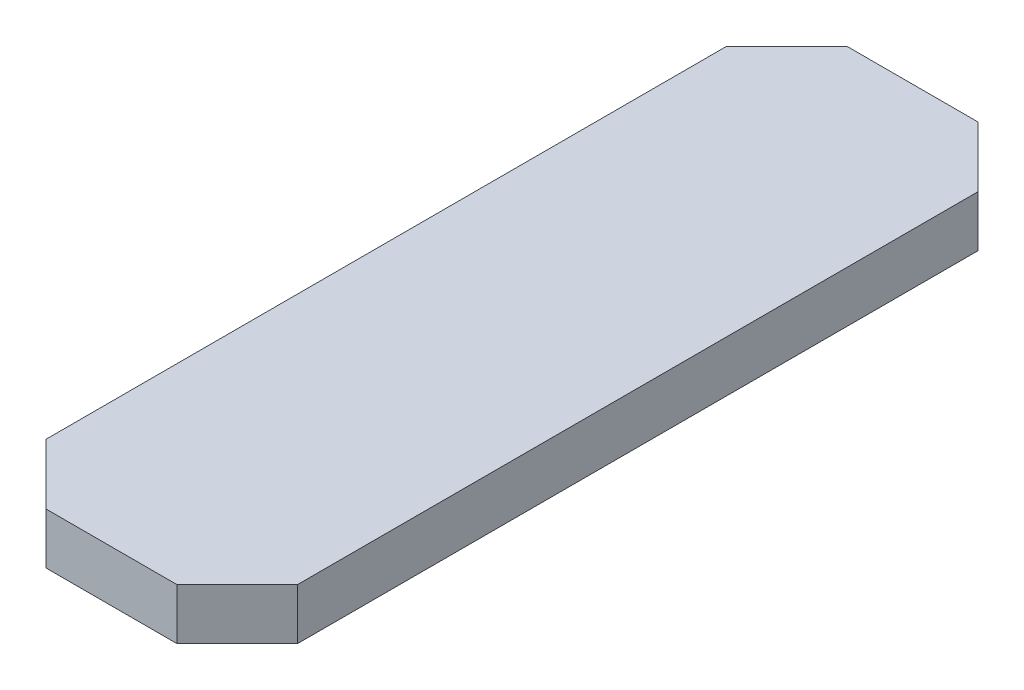
ISO-10303-21;
HEADER;
FILE_DESCRIPTION(('STEP AP214'),'2;1');
FILE_NAME('part.step','',(''),(''),'','','');
FILE_SCHEMA(('AUTOMOTIVE_DESIGN { 1 0 10303 214 1 1 1 1 }'));
ENDSEC;
DATA;
#1=APPLICATION_CONTEXT('core data for automotive mechanical design processes');
#2=APPLICATION_PROTOCOL_DEFINITION('international standard','automotive_design',2000,#1);
#3=PRODUCT_CONTEXT('',#1,'mechanical');
#4=PRODUCT('Part','Part','',(#3));
#5=PRODUCT_RELATED_PRODUCT_CATEGORY('part','',(#4));
#6=PRODUCT_DEFINITION_FORMATION('','',#4);
#7=PRODUCT_DEFINITION_CONTEXT('part definition',#1,'design');
#8=PRODUCT_DEFINITION('design','',#6,#7);
#9=PRODUCT_DEFINITION_SHAPE('','',#8);
#10=(LENGTH_UNIT() NAMED_UNIT(*) SI_UNIT(.MILLI.,.METRE.));
#11=(NAMED_UNIT(*) PLANE_ANGLE_UNIT() SI_UNIT($,.RADIAN.));
#12=(NAMED_UNIT(*) SI_UNIT($,.STERADIAN.) SOLID_ANGLE_UNIT());
#13=UNCERTAINTY_MEASURE_WITH_UNIT(LENGTH_MEASURE(1.E-05),#10,'distance_accuracy_value','');
#14=(GEOMETRIC_REPRESENTATION_CONTEXT(3) GLOBAL_UNCERTAINTY_ASSIGNED_CONTEXT((#13)) GLOBAL_UNIT_ASSIGNED_CONTEXT((#10,
#11,#12)) REPRESENTATION_CONTEXT('',''));
#15=CARTESIAN_POINT('',(0.,0.,0.));
#16=DIRECTION('',(0.,0.,1.));
#17=DIRECTION('',(1.,0.,0.));
#18=AXIS2_PLACEMENT_3D('',#15,#16,#17);
#19=CARTESIAN_POINT('',(62.5,25.4,-199.));
#20=DIRECTION('',(-1.,0.,0.));
#21=DIRECTION('',(0.,0.,1.));
#22=AXIS2_PLACEMENT_3D('',#19,#20,#21);
#23=PLANE('',#22);
#24=DIRECTION('',(0.,0.,-1.));
#25=VECTOR('',#24,1.);
#26=CARTESIAN_POINT('',(62.5,0.,-199.));
#27=LINE('',#26,#25);
#28=CARTESIAN_POINT('',(62.5,0.,169.));
#29=VERTEX_POINT('',#28);
#30=CARTESIAN_POINT('',(62.5,0.,-169.));
#31=VERTEX_POINT('',#30);
#32=EDGE_CURVE('E128',#29,#31,#27,.T.);
#33=ORIENTED_EDGE('',*,*,#32,.T.);
#34=DIRECTION('',(0.,1.,0.));
#35=VECTOR('',#34,1.);
#36=CARTESIAN_POINT('',(62.5,25.4,-169.));
#37=LINE('',#36,#35);
#38=CARTESIAN_POINT('',(62.5,25.4,-169.));
#39=VERTEX_POINT('',#38);
#40=EDGE_CURVE('E151',#31,#39,#37,.T.);
#41=ORIENTED_EDGE('',*,*,#40,.T.);
#42=DIRECTION('',(0.,0.,-1.));
#43=VECTOR('',#42,1.);
#44=CARTESIAN_POINT('',(62.5,25.4,-199.));
#45=LINE('',#44,#43);
#46=CARTESIAN_POINT('',(62.5,25.4,169.));
#47=VERTEX_POINT('',#46);
#48=EDGE_CURVE('E126',#47,#39,#45,.T.);
#49=ORIENTED_EDGE('',*,*,#48,.F.);
#50=DIRECTION('',(0.,-1.,0.));
#51=VECTOR('',#50,1.);
#52=CARTESIAN_POINT('',(62.5,25.4,169.));
#53=LINE('',#52,#51);
#54=EDGE_CURVE('E148',#47,#29,#53,.T.);
#55=ORIENTED_EDGE('',*,*,#54,.T.);
#56=EDGE_LOOP('',(#33,#41,#49,#55));
#57=FACE_BOUND('',#56,.T.);
#58=ADVANCED_FACE('F33',(#57),#23,.F.);
#59=CARTESIAN_POINT('',(-62.5,25.4,-199.));
#60=DIRECTION('',(0.,0.,1.));
#61=DIRECTION('',(1.,0.,0.));
#62=AXIS2_PLACEMENT_3D('',#59,#60,#61);
#63=PLANE('',#62);
#64=DIRECTION('',(-1.,0.,0.));
#65=VECTOR('',#64,1.);
#66=CARTESIAN_POINT('',(-62.5,0.,-199.));
#67=LINE('',#66,#65);
#68=CARTESIAN_POINT('',(32.5,0.,-199.));
#69=VERTEX_POINT('',#68);
#70=CARTESIAN_POINT('',(-32.4999999999999,0.,-199.));
#71=VERTEX_POINT('',#70);
#72=EDGE_CURVE('E124',#69,#71,#67,.T.);
#73=ORIENTED_EDGE('',*,*,#72,.T.);
#74=DIRECTION('',(0.,1.,0.));
#75=VECTOR('',#74,1.);
#76=CARTESIAN_POINT('',(-32.4999999999999,25.4,-199.));
#77=LINE('',#76,#75);
#78=CARTESIAN_POINT('',(-32.4999999999999,25.4,-199.));
#79=VERTEX_POINT('',#78);
#80=EDGE_CURVE('E103',#71,#79,#77,.T.);
#81=ORIENTED_EDGE('',*,*,#80,.T.);
#82=DIRECTION('',(-1.,0.,0.));
#83=VECTOR('',#82,1.);
#84=CARTESIAN_POINT('',(-62.5,25.4,-199.));
#85=LINE('',#84,#83);
#86=CARTESIAN_POINT('',(32.5,25.4,-199.));
#87=VERTEX_POINT('',#86);
#88=EDGE_CURVE('E167',#87,#79,#85,.T.);
#89=ORIENTED_EDGE('',*,*,#88,.F.);
#90=DIRECTION('',(0.,-1.,0.));
#91=VECTOR('',#90,1.);
#92=CARTESIAN_POINT('',(32.5,25.4,-199.));
#93=LINE('',#92,#91);
#94=EDGE_CURVE('E108',#87,#69,#93,.T.);
#95=ORIENTED_EDGE('',*,*,#94,.T.);
#96=EDGE_LOOP('',(#73,#81,#89,#95));
#97=FACE_BOUND('',#96,.T.);
#98=ADVANCED_FACE('F184',(#97),#63,.F.);
#99=CARTESIAN_POINT('',(-62.5,25.4,-199.));
#100=DIRECTION('',(1.,0.,0.));
#101=DIRECTION('',(0.,0.,-1.));
#102=AXIS2_PLACEMENT_3D('',#99,#100,#101);
#103=PLANE('',#102);
#104=DIRECTION('',(0.,0.,1.));
#105=VECTOR('',#104,1.);
#106=CARTESIAN_POINT('',(-62.5,25.4,-199.));
#107=LINE('',#106,#105);
#108=CARTESIAN_POINT('',(-62.5,25.4,-169.));
#109=VERTEX_POINT('',#108);
#110=CARTESIAN_POINT('',(-62.5,25.4,169.));
#111=VERTEX_POINT('',#110);
#112=EDGE_CURVE('E117',#109,#111,#107,.T.);
#113=ORIENTED_EDGE('',*,*,#112,.F.);
#114=DIRECTION('',(0.,-1.,0.));
#115=VECTOR('',#114,1.);
#116=CARTESIAN_POINT('',(-62.5,25.4,-169.));
#117=LINE('',#116,#115);
#118=CARTESIAN_POINT('',(-62.5,0.,-169.));
#119=VERTEX_POINT('',#118);
#120=EDGE_CURVE('E102',#109,#119,#117,.T.);
#121=ORIENTED_EDGE('',*,*,#120,.T.);
#122=DIRECTION('',(0.,0.,1.));
#123=VECTOR('',#122,1.);
#124=CARTESIAN_POINT('',(-62.5,0.,-199.));
#125=LINE('',#124,#123);
#126=CARTESIAN_POINT('',(-62.5,0.,169.));
#127=VERTEX_POINT('',#126);
#128=EDGE_CURVE('E115',#119,#127,#125,.T.);
#129=ORIENTED_EDGE('',*,*,#128,.T.);
#130=DIRECTION('',(0.,1.,0.));
#131=VECTOR('',#130,1.);
#132=CARTESIAN_POINT('',(-62.5,25.4,169.));
#133=LINE('',#132,#131);
#134=EDGE_CURVE('E119',#127,#111,#133,.T.);
#135=ORIENTED_EDGE('',*,*,#134,.T.);
#136=EDGE_LOOP('',(#113,#121,#129,#135));
#137=FACE_BOUND('',#136,.T.);
#138=ADVANCED_FACE('F114',(#137),#103,.F.);
#139=CARTESIAN_POINT('',(-62.5,25.4,199.));
#140=DIRECTION('',(0.,0.,-1.));
#141=DIRECTION('',(-1.,0.,0.));
#142=AXIS2_PLACEMENT_3D('',#139,#140,#141);
#143=PLANE('',#142);
#144=DIRECTION('',(1.,0.,0.));
#145=VECTOR('',#144,1.);
#146=CARTESIAN_POINT('',(-62.5,0.,199.));
#147=LINE('',#146,#145);
#148=CARTESIAN_POINT('',(-32.5,0.,199.));
#149=VERTEX_POINT('',#148);
#150=CARTESIAN_POINT('',(32.4999999999999,0.,199.));
#151=VERTEX_POINT('',#150);
#152=EDGE_CURVE('E123',#149,#151,#147,.T.);
#153=ORIENTED_EDGE('',*,*,#152,.T.);
#154=DIRECTION('',(0.,1.,0.));
#155=VECTOR('',#154,1.);
#156=CARTESIAN_POINT('',(32.4999999999999,25.4,199.));
#157=LINE('',#156,#155);
#158=CARTESIAN_POINT('',(32.4999999999999,25.4,199.));
#159=VERTEX_POINT('',#158);
#160=EDGE_CURVE('E11',#151,#159,#157,.T.);
#161=ORIENTED_EDGE('',*,*,#160,.T.);
#162=DIRECTION('',(1.,0.,0.));
#163=VECTOR('',#162,1.);
#164=CARTESIAN_POINT('',(-62.5,25.4,199.));
#165=LINE('',#164,#163);
#166=CARTESIAN_POINT('',(-32.5,25.4,199.));
#167=VERTEX_POINT('',#166);
#168=EDGE_CURVE('E132',#167,#159,#165,.T.);
#169=ORIENTED_EDGE('',*,*,#168,.F.);
#170=DIRECTION('',(0.,-1.,0.));
#171=VECTOR('',#170,1.);
#172=CARTESIAN_POINT('',(-32.5,25.4,199.));
#173=LINE('',#172,#171);
#174=EDGE_CURVE('E41',#167,#149,#173,.T.);
#175=ORIENTED_EDGE('',*,*,#174,.T.);
#176=EDGE_LOOP('',(#153,#161,#169,#175));
#177=FACE_BOUND('',#176,.T.);
#178=ADVANCED_FACE('F154',(#177),#143,.F.);
#179=CARTESIAN_POINT('',(0.,25.4,0.));
#180=DIRECTION('',(0.,1.,0.));
#181=DIRECTION('',(0.,0.,1.));
#182=AXIS2_PLACEMENT_3D('',#179,#180,#181);
#183=PLANE('',#182);
#184=ORIENTED_EDGE('',*,*,#88,.T.);
#185=DIRECTION('',(0.707106781186549,0.,-0.707106781186546));
#186=VECTOR('',#185,1.);
#187=CARTESIAN_POINT('',(-115.75,25.4,-115.75));
#188=LINE('',#187,#186);
#189=EDGE_CURVE('E146',#79,#109,#188,.F.);
#190=ORIENTED_EDGE('',*,*,#189,.T.);
#191=ORIENTED_EDGE('',*,*,#112,.T.);
#192=DIRECTION('',(-0.707106781186546,0.,-0.707106781186549));
#193=VECTOR('',#192,1.);
#194=CARTESIAN_POINT('',(-115.75,25.4,115.75));
#195=LINE('',#194,#193);
#196=EDGE_CURVE('E53',#111,#167,#195,.F.);
#197=ORIENTED_EDGE('',*,*,#196,.T.);
#198=ORIENTED_EDGE('',*,*,#168,.T.);
#199=DIRECTION('',(-0.707106781186549,0.,0.707106781186546));
#200=VECTOR('',#199,1.);
#201=CARTESIAN_POINT('',(115.75,25.4,115.75));
#202=LINE('',#201,#200);
#203=EDGE_CURVE('E142',#159,#47,#202,.F.);
#204=ORIENTED_EDGE('',*,*,#203,.T.);
#205=ORIENTED_EDGE('',*,*,#48,.T.);
#206=DIRECTION('',(0.707106781186546,0.,0.707106781186549));
#207=VECTOR('',#206,1.);
#208=CARTESIAN_POINT('',(115.75,25.4,-115.749999999999));
#209=LINE('',#208,#207);
#210=EDGE_CURVE('E144',#39,#87,#209,.F.);
#211=ORIENTED_EDGE('',*,*,#210,.T.);
#212=EDGE_LOOP('',(#184,#190,#191,#197,#198,#204,#205,#211));
#213=FACE_BOUND('',#212,.T.);
#214=ADVANCED_FACE('F173',(#213),#183,.T.);
#215=CARTESIAN_POINT('',(0.,0.,0.));
#216=DIRECTION('',(0.,1.,0.));
#217=DIRECTION('',(0.,0.,1.));
#218=AXIS2_PLACEMENT_3D('',#215,#216,#217);
#219=PLANE('',#218);
#220=ORIENTED_EDGE('',*,*,#128,.F.);
#221=DIRECTION('',(-0.707106781186549,0.,0.707106781186546));
#222=VECTOR('',#221,1.);
#223=CARTESIAN_POINT('',(-62.5,0.,-169.));
#224=LINE('',#223,#222);
#225=EDGE_CURVE('E98',#119,#71,#224,.F.);
#226=ORIENTED_EDGE('',*,*,#225,.T.);
#227=ORIENTED_EDGE('',*,*,#72,.F.);
#228=DIRECTION('',(-0.707106781186546,0.,-0.707106781186549));
#229=VECTOR('',#228,1.);
#230=CARTESIAN_POINT('',(32.5,0.,-199.));
#231=LINE('',#230,#229);
#232=EDGE_CURVE('E109',#69,#31,#231,.F.);
#233=ORIENTED_EDGE('',*,*,#232,.T.);
#234=ORIENTED_EDGE('',*,*,#32,.F.);
#235=DIRECTION('',(0.707106781186549,0.,-0.707106781186546));
#236=VECTOR('',#235,1.);
#237=CARTESIAN_POINT('',(62.5,0.,169.));
#238=LINE('',#237,#236);
#239=EDGE_CURVE('E135',#29,#151,#238,.F.);
#240=ORIENTED_EDGE('',*,*,#239,.T.);
#241=ORIENTED_EDGE('',*,*,#152,.F.);
#242=DIRECTION('',(0.707106781186546,0.,0.707106781186549));
#243=VECTOR('',#242,1.);
#244=CARTESIAN_POINT('',(-32.5,0.,199.));
#245=LINE('',#244,#243);
#246=EDGE_CURVE('E118',#149,#127,#245,.F.);
#247=ORIENTED_EDGE('',*,*,#246,.T.);
#248=EDGE_LOOP('',(#220,#226,#227,#233,#234,#240,#241,#247));
#249=FACE_BOUND('',#248,.T.);
#250=ADVANCED_FACE('F121',(#249),#219,.F.);
#251=CARTESIAN_POINT('',(-62.5,25.4,-169.));
#252=DIRECTION('',(0.707106781186546,0.,0.707106781186549));
#253=DIRECTION('',(0.,-1.,0.));
#254=AXIS2_PLACEMENT_3D('',#251,#252,#253);
#255=PLANE('',#254);
#256=ORIENTED_EDGE('',*,*,#189,.F.);
#257=ORIENTED_EDGE('',*,*,#80,.F.);
#258=ORIENTED_EDGE('',*,*,#225,.F.);
#259=ORIENTED_EDGE('',*,*,#120,.F.);
#260=EDGE_LOOP('',(#256,#257,#258,#259));
#261=FACE_BOUND('',#260,.T.);
#262=ADVANCED_FACE('F101',(#261),#255,.F.);
#263=CARTESIAN_POINT('',(32.5,25.4,-199.));
#264=DIRECTION('',(-0.707106781186549,0.,0.707106781186546));
#265=DIRECTION('',(0.,-1.,0.));
#266=AXIS2_PLACEMENT_3D('',#263,#264,#265);
#267=PLANE('',#266);
#268=ORIENTED_EDGE('',*,*,#210,.F.);
#269=ORIENTED_EDGE('',*,*,#40,.F.);
#270=ORIENTED_EDGE('',*,*,#232,.F.);
#271=ORIENTED_EDGE('',*,*,#94,.F.);
#272=EDGE_LOOP('',(#268,#269,#270,#271));
#273=FACE_BOUND('',#272,.T.);
#274=ADVANCED_FACE('F195',(#273),#267,.F.);
#275=CARTESIAN_POINT('',(62.5,25.4,169.));
#276=DIRECTION('',(-0.707106781186546,0.,-0.707106781186549));
#277=DIRECTION('',(0.,-1.,0.));
#278=AXIS2_PLACEMENT_3D('',#275,#276,#277);
#279=PLANE('',#278);
#280=ORIENTED_EDGE('',*,*,#203,.F.);
#281=ORIENTED_EDGE('',*,*,#160,.F.);
#282=ORIENTED_EDGE('',*,*,#239,.F.);
#283=ORIENTED_EDGE('',*,*,#54,.F.);
#284=EDGE_LOOP('',(#280,#281,#282,#283));
#285=FACE_BOUND('',#284,.T.);
#286=ADVANCED_FACE('F161',(#285),#279,.F.);
#287=CARTESIAN_POINT('',(-32.5,25.4,199.));
#288=DIRECTION('',(0.707106781186549,0.,-0.707106781186546));
#289=DIRECTION('',(0.,-1.,0.));
#290=AXIS2_PLACEMENT_3D('',#287,#288,#289);
#291=PLANE('',#290);
#292=ORIENTED_EDGE('',*,*,#196,.F.);
#293=ORIENTED_EDGE('',*,*,#134,.F.);
#294=ORIENTED_EDGE('',*,*,#246,.F.);
#295=ORIENTED_EDGE('',*,*,#174,.F.);
#296=EDGE_LOOP('',(#292,#293,#294,#295));
#297=FACE_BOUND('',#296,.T.);
#298=ADVANCED_FACE('F35',(#297),#291,.F.);
#299=CLOSED_SHELL('',(#58,#98,#138,#178,#214,#250,#262,#274,#286,#298));
#300=MANIFOLD_SOLID_BREP('B2',#299);
#301=ADVANCED_BREP_SHAPE_REPRESENTATION('',(#18,#300),#14);
#302=SHAPE_DEFINITION_REPRESENTATION(#9,#301);
ENDSEC;
END-ISO-10303-21;
